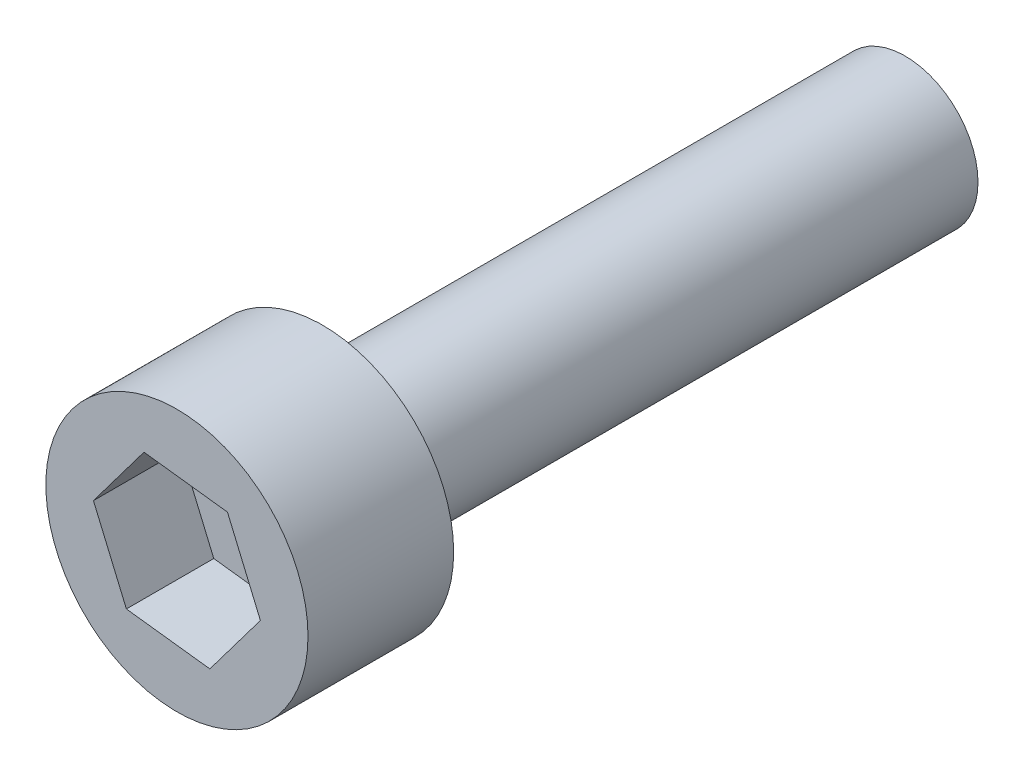
ISO-10303-21;
HEADER;
FILE_DESCRIPTION(('STEP AP214'),'2;1');
FILE_NAME('part.step','',(''),(''),'','','');
FILE_SCHEMA(('AUTOMOTIVE_DESIGN { 1 0 10303 214 1 1 1 1 }'));
ENDSEC;
DATA;
#1=APPLICATION_CONTEXT('core data for automotive mechanical design processes');
#2=APPLICATION_PROTOCOL_DEFINITION('international standard','automotive_design',2000,#1);
#3=PRODUCT_CONTEXT('',#1,'mechanical');
#4=PRODUCT('Part','Part','',(#3));
#5=PRODUCT_RELATED_PRODUCT_CATEGORY('part','',(#4));
#6=PRODUCT_DEFINITION_FORMATION('','',#4);
#7=PRODUCT_DEFINITION_CONTEXT('part definition',#1,'design');
#8=PRODUCT_DEFINITION('design','',#6,#7);
#9=PRODUCT_DEFINITION_SHAPE('','',#8);
#10=(LENGTH_UNIT() NAMED_UNIT(*) SI_UNIT(.MILLI.,.METRE.));
#11=(NAMED_UNIT(*) PLANE_ANGLE_UNIT() SI_UNIT($,.RADIAN.));
#12=(NAMED_UNIT(*) SI_UNIT($,.STERADIAN.) SOLID_ANGLE_UNIT());
#13=UNCERTAINTY_MEASURE_WITH_UNIT(LENGTH_MEASURE(1.E-05),#10,'distance_accuracy_value','');
#14=(GEOMETRIC_REPRESENTATION_CONTEXT(3) GLOBAL_UNCERTAINTY_ASSIGNED_CONTEXT((#13)) GLOBAL_UNIT_ASSIGNED_CONTEXT((#10,
#11,#12)) REPRESENTATION_CONTEXT('',''));
#15=CARTESIAN_POINT('',(0.,0.,0.));
#16=DIRECTION('',(0.,0.,1.));
#17=DIRECTION('',(1.,0.,0.));
#18=AXIS2_PLACEMENT_3D('',#15,#16,#17);
#19=CARTESIAN_POINT('',(0.,0.,10.));
#20=DIRECTION('',(0.,0.,-1.));
#21=DIRECTION('',(-1.,0.,0.));
#22=AXIS2_PLACEMENT_3D('',#19,#20,#21);
#23=CYLINDRICAL_SURFACE('',#22,1.25);
#24=CARTESIAN_POINT('',(0.,0.,10.));
#25=DIRECTION('',(0.,0.,1.));
#26=DIRECTION('',(1.,0.,0.));
#27=AXIS2_PLACEMENT_3D('',#24,#25,#26);
#28=CIRCLE('',#27,1.25);
#29=CARTESIAN_POINT('',(1.25,0.,10.));
#30=VERTEX_POINT('',#29);
#31=EDGE_CURVE('E11',#30,#30,#28,.T.);
#32=ORIENTED_EDGE('',*,*,#31,.F.);
#33=EDGE_LOOP('',(#32));
#34=FACE_BOUND('',#33,.T.);
#35=CARTESIAN_POINT('',(0.,0.,0.));
#36=DIRECTION('',(0.,0.,1.));
#37=DIRECTION('',(1.,0.,0.));
#38=AXIS2_PLACEMENT_3D('',#35,#36,#37);
#39=CIRCLE('',#38,1.25);
#40=CARTESIAN_POINT('',(1.25,0.,0.));
#41=VERTEX_POINT('',#40);
#42=EDGE_CURVE('E42',#41,#41,#39,.T.);
#43=ORIENTED_EDGE('',*,*,#42,.T.);
#44=EDGE_LOOP('',(#43));
#45=FACE_BOUND('',#44,.T.);
#46=ADVANCED_FACE('F39',(#34,#45),#23,.T.);
#47=CARTESIAN_POINT('',(0.,0.,0.));
#48=DIRECTION('',(0.,0.,1.));
#49=DIRECTION('',(1.,0.,0.));
#50=AXIS2_PLACEMENT_3D('',#47,#48,#49);
#51=PLANE('',#50);
#52=ORIENTED_EDGE('',*,*,#42,.F.);
#53=EDGE_LOOP('',(#52));
#54=FACE_BOUND('',#53,.T.);
#55=ADVANCED_FACE('F189',(#54),#51,.F.);
#56=CARTESIAN_POINT('',(0.,0.,12.5));
#57=DIRECTION('',(0.,0.,-1.));
#58=DIRECTION('',(-1.,0.,0.));
#59=AXIS2_PLACEMENT_3D('',#56,#57,#58);
#60=CYLINDRICAL_SURFACE('',#59,2.25);
#61=CARTESIAN_POINT('',(0.,0.,12.5));
#62=DIRECTION('',(0.,0.,1.));
#63=DIRECTION('',(1.,0.,0.));
#64=AXIS2_PLACEMENT_3D('',#61,#62,#63);
#65=CIRCLE('',#64,2.25);
#66=CARTESIAN_POINT('',(2.25,0.,12.5));
#67=VERTEX_POINT('',#66);
#68=EDGE_CURVE('E163',#67,#67,#65,.T.);
#69=ORIENTED_EDGE('',*,*,#68,.F.);
#70=EDGE_LOOP('',(#69));
#71=FACE_BOUND('',#70,.T.);
#72=CARTESIAN_POINT('',(0.,0.,10.));
#73=DIRECTION('',(0.,0.,1.));
#74=DIRECTION('',(1.,0.,0.));
#75=AXIS2_PLACEMENT_3D('',#72,#73,#74);
#76=CIRCLE('',#75,2.25);
#77=CARTESIAN_POINT('',(2.25,0.,10.));
#78=VERTEX_POINT('',#77);
#79=EDGE_CURVE('E153',#78,#78,#76,.T.);
#80=ORIENTED_EDGE('',*,*,#79,.T.);
#81=EDGE_LOOP('',(#80));
#82=FACE_BOUND('',#81,.T.);
#83=ADVANCED_FACE('F171',(#71,#82),#60,.T.);
#84=CARTESIAN_POINT('',(0.,0.,12.5));
#85=DIRECTION('',(0.,0.,1.));
#86=DIRECTION('',(1.,0.,0.));
#87=AXIS2_PLACEMENT_3D('',#84,#85,#86);
#88=PLANE('',#87);
#89=DIRECTION('',(0.601002146135822,0.799247408716561,0.));
#90=VECTOR('',#89,1.);
#91=CARTESIAN_POINT('',(0.565323322326876,-1.3280598158843,12.5));
#92=LINE('',#91,#90);
#93=CARTESIAN_POINT('',(0.565323322326876,-1.3280598158843,12.5));
#94=VERTEX_POINT('',#93);
#95=CARTESIAN_POINT('',(1.43279519946452,-0.174445549455256,12.5));
#96=VERTEX_POINT('',#95);
#97=EDGE_CURVE('E54',#94,#96,#92,.T.);
#98=ORIENTED_EDGE('',*,*,#97,.F.);
#99=DIRECTION('',(0.992669632925336,-0.120859421924309,0.));
#100=VECTOR('',#99,1.);
#101=CARTESIAN_POINT('',(-0.867471877137649,-1.15361426642904,12.5));
#102=LINE('',#101,#100);
#103=CARTESIAN_POINT('',(-0.867471877137649,-1.15361426642904,12.5));
#104=VERTEX_POINT('',#103);
#105=EDGE_CURVE('E147',#104,#94,#102,.T.);
#106=ORIENTED_EDGE('',*,*,#105,.F.);
#107=DIRECTION('',(0.391667486789515,-0.920106830640869,0.));
#108=VECTOR('',#107,1.);
#109=CARTESIAN_POINT('',(-1.43279519946452,0.174445549455256,12.5));
#110=LINE('',#109,#108);
#111=CARTESIAN_POINT('',(-1.43279519946452,0.174445549455256,12.5));
#112=VERTEX_POINT('',#111);
#113=EDGE_CURVE('E144',#112,#104,#110,.T.);
#114=ORIENTED_EDGE('',*,*,#113,.F.);
#115=DIRECTION('',(-0.601002146135822,-0.79924740871656,0.));
#116=VECTOR('',#115,1.);
#117=CARTESIAN_POINT('',(-0.565323322326876,1.3280598158843,12.5));
#118=LINE('',#117,#116);
#119=CARTESIAN_POINT('',(-0.565323322326876,1.3280598158843,12.5));
#120=VERTEX_POINT('',#119);
#121=EDGE_CURVE('E102',#120,#112,#118,.T.);
#122=ORIENTED_EDGE('',*,*,#121,.F.);
#123=DIRECTION('',(-0.992669632925336,0.120859421924309,0.));
#124=VECTOR('',#123,1.);
#125=CARTESIAN_POINT('',(0.867471877137649,1.15361426642904,12.5));
#126=LINE('',#125,#124);
#127=CARTESIAN_POINT('',(0.867471877137649,1.15361426642904,12.5));
#128=VERTEX_POINT('',#127);
#129=EDGE_CURVE('E138',#128,#120,#126,.T.);
#130=ORIENTED_EDGE('',*,*,#129,.F.);
#131=DIRECTION('',(-0.391667486789515,0.920106830640869,0.));
#132=VECTOR('',#131,1.);
#133=CARTESIAN_POINT('',(1.43279519946452,-0.174445549455256,12.5));
#134=LINE('',#133,#132);
#135=EDGE_CURVE('E134',#96,#128,#134,.T.);
#136=ORIENTED_EDGE('',*,*,#135,.F.);
#137=EDGE_LOOP('',(#98,#106,#114,#122,#130,#136));
#138=FACE_BOUND('',#137,.T.);
#139=ORIENTED_EDGE('',*,*,#68,.T.);
#140=EDGE_LOOP('',(#139));
#141=FACE_BOUND('',#140,.T.);
#142=ADVANCED_FACE('F176',(#138,#141),#88,.T.);
#143=CARTESIAN_POINT('',(0.,0.,10.));
#144=DIRECTION('',(0.,0.,1.));
#145=DIRECTION('',(1.,0.,0.));
#146=AXIS2_PLACEMENT_3D('',#143,#144,#145);
#147=PLANE('',#146);
#148=ORIENTED_EDGE('',*,*,#31,.T.);
#149=EDGE_LOOP('',(#148));
#150=FACE_BOUND('',#149,.T.);
#151=ORIENTED_EDGE('',*,*,#79,.F.);
#152=EDGE_LOOP('',(#151));
#153=FACE_BOUND('',#152,.T.);
#154=ADVANCED_FACE('F173',(#150,#153),#147,.F.);
#155=CARTESIAN_POINT('',(0.565323322326876,-1.3280598158843,11.));
#156=DIRECTION('',(0.79924740871656,-0.601002146135821,0.));
#157=DIRECTION('',(0.601002146135822,0.799247408716561,0.));
#158=AXIS2_PLACEMENT_3D('',#155,#156,#157);
#159=PLANE('',#158);
#160=ORIENTED_EDGE('',*,*,#97,.T.);
#161=DIRECTION('',(0.,0.,1.));
#162=VECTOR('',#161,1.);
#163=CARTESIAN_POINT('',(1.43279519946452,-0.174445549455256,11.));
#164=LINE('',#163,#162);
#165=CARTESIAN_POINT('',(1.43279519946452,-0.174445549455256,11.));
#166=VERTEX_POINT('',#165);
#167=EDGE_CURVE('E84',#166,#96,#164,.T.);
#168=ORIENTED_EDGE('',*,*,#167,.F.);
#169=DIRECTION('',(0.601002146135822,0.799247408716561,0.));
#170=VECTOR('',#169,1.);
#171=CARTESIAN_POINT('',(0.565323322326876,-1.3280598158843,11.));
#172=LINE('',#171,#170);
#173=CARTESIAN_POINT('',(0.565323322326876,-1.3280598158843,11.));
#174=VERTEX_POINT('',#173);
#175=EDGE_CURVE('E150',#174,#166,#172,.T.);
#176=ORIENTED_EDGE('',*,*,#175,.F.);
#177=DIRECTION('',(0.,0.,1.));
#178=VECTOR('',#177,1.);
#179=CARTESIAN_POINT('',(0.565323322326876,-1.3280598158843,11.));
#180=LINE('',#179,#178);
#181=EDGE_CURVE('E62',#174,#94,#180,.T.);
#182=ORIENTED_EDGE('',*,*,#181,.T.);
#183=EDGE_LOOP('',(#160,#168,#176,#182));
#184=FACE_BOUND('',#183,.T.);
#185=ADVANCED_FACE('F175',(#184),#159,.F.);
#186=CARTESIAN_POINT('',(-0.867471877137649,-1.15361426642904,11.));
#187=DIRECTION('',(-0.120859421924309,-0.992669632925336,0.));
#188=DIRECTION('',(0.992669632925336,-0.120859421924309,0.));
#189=AXIS2_PLACEMENT_3D('',#186,#187,#188);
#190=PLANE('',#189);
#191=ORIENTED_EDGE('',*,*,#105,.T.);
#192=ORIENTED_EDGE('',*,*,#181,.F.);
#193=DIRECTION('',(0.992669632925336,-0.120859421924309,0.));
#194=VECTOR('',#193,1.);
#195=CARTESIAN_POINT('',(-0.867471877137649,-1.15361426642904,11.));
#196=LINE('',#195,#194);
#197=CARTESIAN_POINT('',(-0.867471877137649,-1.15361426642904,11.));
#198=VERTEX_POINT('',#197);
#199=EDGE_CURVE('E116',#198,#174,#196,.T.);
#200=ORIENTED_EDGE('',*,*,#199,.F.);
#201=DIRECTION('',(0.,0.,1.));
#202=VECTOR('',#201,1.);
#203=CARTESIAN_POINT('',(-0.867471877137649,-1.15361426642904,11.));
#204=LINE('',#203,#202);
#205=EDGE_CURVE('E107',#198,#104,#204,.T.);
#206=ORIENTED_EDGE('',*,*,#205,.T.);
#207=EDGE_LOOP('',(#191,#192,#200,#206));
#208=FACE_BOUND('',#207,.T.);
#209=ADVANCED_FACE('F183',(#208),#190,.F.);
#210=CARTESIAN_POINT('',(-1.43279519946452,0.174445549455256,11.));
#211=DIRECTION('',(-0.920106830640869,-0.391667486789515,0.));
#212=DIRECTION('',(0.391667486789515,-0.920106830640869,0.));
#213=AXIS2_PLACEMENT_3D('',#210,#211,#212);
#214=PLANE('',#213);
#215=ORIENTED_EDGE('',*,*,#113,.T.);
#216=ORIENTED_EDGE('',*,*,#205,.F.);
#217=DIRECTION('',(0.391667486789515,-0.920106830640869,0.));
#218=VECTOR('',#217,1.);
#219=CARTESIAN_POINT('',(-1.43279519946452,0.174445549455256,11.));
#220=LINE('',#219,#218);
#221=CARTESIAN_POINT('',(-1.43279519946452,0.174445549455256,11.));
#222=VERTEX_POINT('',#221);
#223=EDGE_CURVE('E111',#222,#198,#220,.T.);
#224=ORIENTED_EDGE('',*,*,#223,.F.);
#225=DIRECTION('',(0.,0.,1.));
#226=VECTOR('',#225,1.);
#227=CARTESIAN_POINT('',(-1.43279519946452,0.174445549455256,11.));
#228=LINE('',#227,#226);
#229=EDGE_CURVE('E95',#222,#112,#228,.T.);
#230=ORIENTED_EDGE('',*,*,#229,.T.);
#231=EDGE_LOOP('',(#215,#216,#224,#230));
#232=FACE_BOUND('',#231,.T.);
#233=ADVANCED_FACE('F112',(#232),#214,.F.);
#234=CARTESIAN_POINT('',(-0.565323322326876,1.3280598158843,11.));
#235=DIRECTION('',(-0.79924740871656,0.601002146135822,0.));
#236=DIRECTION('',(-0.601002146135822,-0.79924740871656,0.));
#237=AXIS2_PLACEMENT_3D('',#234,#235,#236);
#238=PLANE('',#237);
#239=ORIENTED_EDGE('',*,*,#121,.T.);
#240=ORIENTED_EDGE('',*,*,#229,.F.);
#241=DIRECTION('',(-0.601002146135822,-0.79924740871656,0.));
#242=VECTOR('',#241,1.);
#243=CARTESIAN_POINT('',(-0.565323322326876,1.3280598158843,11.));
#244=LINE('',#243,#242);
#245=CARTESIAN_POINT('',(-0.565323322326876,1.3280598158843,11.));
#246=VERTEX_POINT('',#245);
#247=EDGE_CURVE('E99',#246,#222,#244,.T.);
#248=ORIENTED_EDGE('',*,*,#247,.F.);
#249=DIRECTION('',(0.,0.,1.));
#250=VECTOR('',#249,1.);
#251=CARTESIAN_POINT('',(-0.565323322326876,1.3280598158843,11.));
#252=LINE('',#251,#250);
#253=EDGE_CURVE('E108',#246,#120,#252,.T.);
#254=ORIENTED_EDGE('',*,*,#253,.T.);
#255=EDGE_LOOP('',(#239,#240,#248,#254));
#256=FACE_BOUND('',#255,.T.);
#257=ADVANCED_FACE('F97',(#256),#238,.F.);
#258=CARTESIAN_POINT('',(0.867471877137649,1.15361426642904,11.));
#259=DIRECTION('',(0.120859421924309,0.992669632925336,0.));
#260=DIRECTION('',(-0.992669632925336,0.120859421924309,0.));
#261=AXIS2_PLACEMENT_3D('',#258,#259,#260);
#262=PLANE('',#261);
#263=ORIENTED_EDGE('',*,*,#129,.T.);
#264=ORIENTED_EDGE('',*,*,#253,.F.);
#265=DIRECTION('',(-0.992669632925336,0.120859421924309,0.));
#266=VECTOR('',#265,1.);
#267=CARTESIAN_POINT('',(0.867471877137649,1.15361426642904,11.));
#268=LINE('',#267,#266);
#269=CARTESIAN_POINT('',(0.867471877137649,1.15361426642904,11.));
#270=VERTEX_POINT('',#269);
#271=EDGE_CURVE('E122',#270,#246,#268,.T.);
#272=ORIENTED_EDGE('',*,*,#271,.F.);
#273=DIRECTION('',(0.,0.,1.));
#274=VECTOR('',#273,1.);
#275=CARTESIAN_POINT('',(0.867471877137649,1.15361426642904,11.));
#276=LINE('',#275,#274);
#277=EDGE_CURVE('E158',#270,#128,#276,.T.);
#278=ORIENTED_EDGE('',*,*,#277,.T.);
#279=EDGE_LOOP('',(#263,#264,#272,#278));
#280=FACE_BOUND('',#279,.T.);
#281=ADVANCED_FACE('F245',(#280),#262,.F.);
#282=CARTESIAN_POINT('',(1.43279519946452,-0.174445549455256,11.));
#283=DIRECTION('',(0.920106830640869,0.391667486789514,0.));
#284=DIRECTION('',(-0.391667486789514,0.920106830640869,0.));
#285=AXIS2_PLACEMENT_3D('',#282,#283,#284);
#286=PLANE('',#285);
#287=ORIENTED_EDGE('',*,*,#135,.T.);
#288=ORIENTED_EDGE('',*,*,#277,.F.);
#289=DIRECTION('',(-0.391667486789515,0.920106830640869,0.));
#290=VECTOR('',#289,1.);
#291=CARTESIAN_POINT('',(1.43279519946452,-0.174445549455256,11.));
#292=LINE('',#291,#290);
#293=EDGE_CURVE('E126',#166,#270,#292,.T.);
#294=ORIENTED_EDGE('',*,*,#293,.F.);
#295=ORIENTED_EDGE('',*,*,#167,.T.);
#296=EDGE_LOOP('',(#287,#288,#294,#295));
#297=FACE_BOUND('',#296,.T.);
#298=ADVANCED_FACE('F254',(#297),#286,.F.);
#299=CARTESIAN_POINT('',(0.,0.,11.));
#300=DIRECTION('',(0.,0.,1.));
#301=DIRECTION('',(1.,0.,0.));
#302=AXIS2_PLACEMENT_3D('',#299,#300,#301);
#303=PLANE('',#302);
#304=ORIENTED_EDGE('',*,*,#175,.T.);
#305=ORIENTED_EDGE('',*,*,#293,.T.);
#306=ORIENTED_EDGE('',*,*,#271,.T.);
#307=ORIENTED_EDGE('',*,*,#247,.T.);
#308=ORIENTED_EDGE('',*,*,#223,.T.);
#309=ORIENTED_EDGE('',*,*,#199,.T.);
#310=EDGE_LOOP('',(#304,#305,#306,#307,#308,#309));
#311=FACE_BOUND('',#310,.T.);
#312=ADVANCED_FACE('F119',(#311),#303,.T.);
#313=CLOSED_SHELL('',(#46,#55,#83,#142,#154,#185,#209,#233,#257,#281,#298,#312));
#314=MANIFOLD_SOLID_BREP('B2',#313);
#315=ADVANCED_BREP_SHAPE_REPRESENTATION('',(#18,#314),#14);
#316=SHAPE_DEFINITION_REPRESENTATION(#9,#315);
ENDSEC;
END-ISO-10303-21;
